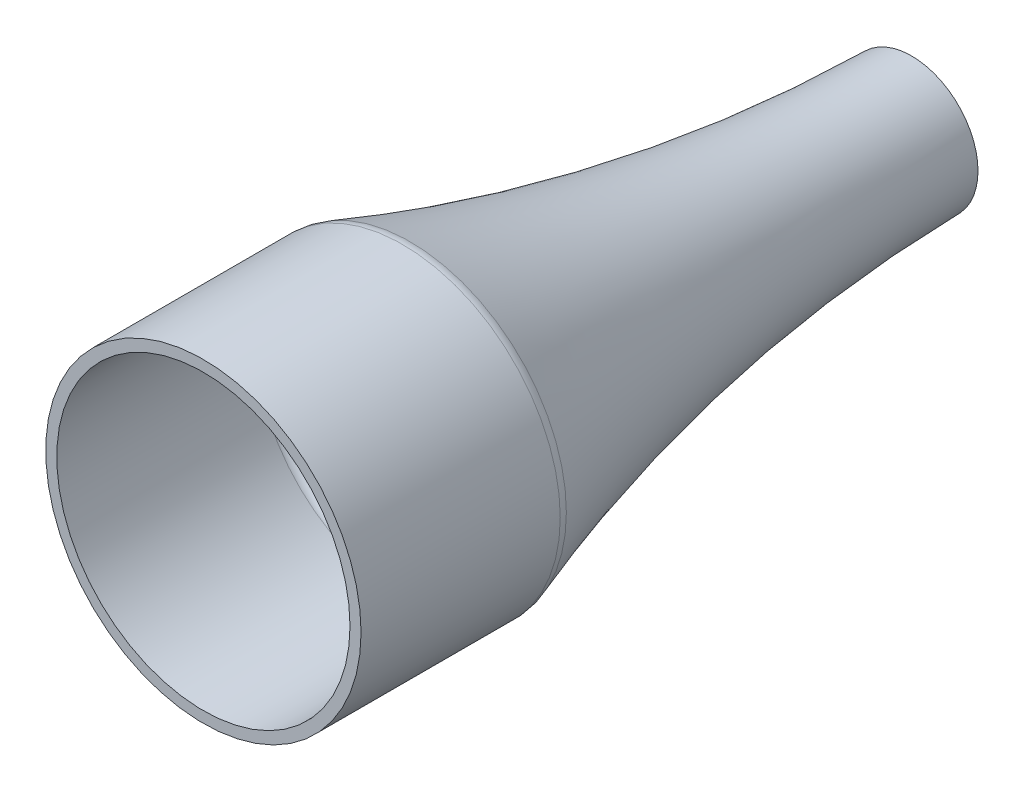
ISO-10303-21;
HEADER;
FILE_DESCRIPTION(('STEP AP214'),'2;1');
FILE_NAME('part.step','',(''),(''),'','','');
FILE_SCHEMA(('AUTOMOTIVE_DESIGN { 1 0 10303 214 1 1 1 1 }'));
ENDSEC;
DATA;
#1=APPLICATION_CONTEXT('core data for automotive mechanical design processes');
#2=APPLICATION_PROTOCOL_DEFINITION('international standard','automotive_design',2000,#1);
#3=PRODUCT_CONTEXT('',#1,'mechanical');
#4=PRODUCT('Part','Part','',(#3));
#5=PRODUCT_RELATED_PRODUCT_CATEGORY('part','',(#4));
#6=PRODUCT_DEFINITION_FORMATION('','',#4);
#7=PRODUCT_DEFINITION_CONTEXT('part definition',#1,'design');
#8=PRODUCT_DEFINITION('design','',#6,#7);
#9=PRODUCT_DEFINITION_SHAPE('','',#8);
#10=(LENGTH_UNIT() NAMED_UNIT(*) SI_UNIT(.MILLI.,.METRE.));
#11=(NAMED_UNIT(*) PLANE_ANGLE_UNIT() SI_UNIT($,.RADIAN.));
#12=(NAMED_UNIT(*) SI_UNIT($,.STERADIAN.) SOLID_ANGLE_UNIT());
#13=UNCERTAINTY_MEASURE_WITH_UNIT(LENGTH_MEASURE(1.E-05),#10,'distance_accuracy_value','');
#14=(GEOMETRIC_REPRESENTATION_CONTEXT(3) GLOBAL_UNCERTAINTY_ASSIGNED_CONTEXT((#13)) GLOBAL_UNIT_ASSIGNED_CONTEXT((#10,
#11,#12)) REPRESENTATION_CONTEXT('',''));
#15=CARTESIAN_POINT('',(0.,0.,0.));
#16=DIRECTION('',(0.,0.,1.));
#17=DIRECTION('',(1.,0.,0.));
#18=AXIS2_PLACEMENT_3D('',#15,#16,#17);
#19=CARTESIAN_POINT('',(0.,0.,0.));
#20=DIRECTION('',(0.,0.,1.));
#21=DIRECTION('',(1.,0.,0.));
#22=AXIS2_PLACEMENT_3D('',#19,#20,#21);
#23=PLANE('',#22);
#24=CARTESIAN_POINT('',(0.,0.,0.));
#25=DIRECTION('',(0.,0.,1.));
#26=DIRECTION('',(1.,0.,0.));
#27=AXIS2_PLACEMENT_3D('',#24,#25,#26);
#28=CIRCLE('',#27,2.5);
#29=CARTESIAN_POINT('',(2.5,0.,0.));
#30=VERTEX_POINT('',#29);
#31=EDGE_CURVE('E65',#30,#30,#28,.T.);
#32=ORIENTED_EDGE('',*,*,#31,.T.);
#33=EDGE_LOOP('',(#32));
#34=FACE_BOUND('',#33,.T.);
#35=CARTESIAN_POINT('',(0.,0.,0.));
#36=DIRECTION('',(0.,0.,1.));
#37=DIRECTION('',(1.,0.,0.));
#38=AXIS2_PLACEMENT_3D('',#35,#36,#37);
#39=CIRCLE('',#38,3.);
#40=CARTESIAN_POINT('',(3.,0.,0.));
#41=VERTEX_POINT('',#40);
#42=EDGE_CURVE('E52',#41,#41,#39,.T.);
#43=ORIENTED_EDGE('',*,*,#42,.F.);
#44=EDGE_LOOP('',(#43));
#45=FACE_BOUND('',#44,.T.);
#46=ADVANCED_FACE('F41',(#34,#45),#23,.F.);
#47=CARTESIAN_POINT('',(0.,0.,22.));
#48=DIRECTION('',(0.,0.,1.));
#49=DIRECTION('',(1.,0.,0.));
#50=AXIS2_PLACEMENT_3D('',#47,#48,#49);
#51=CYLINDRICAL_SURFACE('',#50,7.125);
#52=CARTESIAN_POINT('',(0.,0.,23.));
#53=DIRECTION('',(0.,0.,1.));
#54=DIRECTION('',(1.,0.,0.));
#55=AXIS2_PLACEMENT_3D('',#52,#53,#54);
#56=CIRCLE('',#55,7.125);
#57=CARTESIAN_POINT('',(7.125,0.,23.));
#58=VERTEX_POINT('',#57);
#59=EDGE_CURVE('E48',#58,#58,#56,.T.);
#60=ORIENTED_EDGE('',*,*,#59,.T.);
#61=EDGE_LOOP('',(#60));
#62=FACE_BOUND('',#61,.T.);
#63=CARTESIAN_POINT('',(0.,0.,32.));
#64=DIRECTION('',(0.,0.,1.));
#65=DIRECTION('',(1.,0.,0.));
#66=AXIS2_PLACEMENT_3D('',#63,#64,#65);
#67=CIRCLE('',#66,7.125);
#68=CARTESIAN_POINT('',(7.125,0.,32.));
#69=VERTEX_POINT('',#68);
#70=EDGE_CURVE('E56',#69,#69,#67,.T.);
#71=ORIENTED_EDGE('',*,*,#70,.F.);
#72=EDGE_LOOP('',(#71));
#73=FACE_BOUND('',#72,.T.);
#74=ADVANCED_FACE('F95',(#62,#73),#51,.T.);
#75=CARTESIAN_POINT('',(0.,0.,32.));
#76=DIRECTION('',(0.,0.,1.));
#77=DIRECTION('',(1.,0.,0.));
#78=AXIS2_PLACEMENT_3D('',#75,#76,#77);
#79=PLANE('',#78);
#80=CARTESIAN_POINT('',(0.,0.,32.));
#81=DIRECTION('',(0.,0.,1.));
#82=DIRECTION('',(1.,0.,0.));
#83=AXIS2_PLACEMENT_3D('',#80,#81,#82);
#84=CIRCLE('',#83,6.625);
#85=CARTESIAN_POINT('',(6.625,0.,32.));
#86=VERTEX_POINT('',#85);
#87=EDGE_CURVE('E62',#86,#86,#84,.T.);
#88=ORIENTED_EDGE('',*,*,#87,.F.);
#89=EDGE_LOOP('',(#88));
#90=FACE_BOUND('',#89,.T.);
#91=ORIENTED_EDGE('',*,*,#70,.T.);
#92=EDGE_LOOP('',(#91));
#93=FACE_BOUND('',#92,.T.);
#94=ADVANCED_FACE('F102',(#90,#93),#79,.T.);
#95=CARTESIAN_POINT('',(0.,0.,23.));
#96=DIRECTION('',(0.,0.,1.));
#97=DIRECTION('',(1.,0.,0.));
#98=AXIS2_PLACEMENT_3D('',#95,#96,#97);
#99=TOROIDAL_SURFACE('',#98,6.125,1.);
#100=CARTESIAN_POINT('',(0.,0.,22.6660819521754));
#101=DIRECTION('',(0.,0.,1.));
#102=DIRECTION('',(1.,0.,0.));
#103=AXIS2_PLACEMENT_3D('',#100,#101,#102);
#104=CIRCLE('',#103,7.06760210976688);
#105=CARTESIAN_POINT('',(7.06760210976688,0.,22.6660819521754));
#106=VERTEX_POINT('',#105);
#107=EDGE_CURVE('E10',#106,#106,#104,.T.);
#108=ORIENTED_EDGE('',*,*,#107,.T.);
#109=EDGE_LOOP('',(#108));
#110=FACE_BOUND('',#109,.T.);
#111=ORIENTED_EDGE('',*,*,#59,.F.);
#112=EDGE_LOOP('',(#111));
#113=FACE_BOUND('',#112,.T.);
#114=ADVANCED_FACE('F106',(#110,#113),#99,.T.);
#115=CARTESIAN_POINT('',(0.,0.,32.));
#116=DIRECTION('',(0.,0.,-1.));
#117=DIRECTION('',(-1.,0.,0.));
#118=AXIS2_PLACEMENT_3D('',#115,#116,#117);
#119=CYLINDRICAL_SURFACE('',#118,2.5);
#120=ORIENTED_EDGE('',*,*,#31,.F.);
#121=EDGE_LOOP('',(#120));
#122=FACE_BOUND('',#121,.T.);
#123=CARTESIAN_POINT('',(0.,0.,22.5));
#124=DIRECTION('',(0.,0.,1.));
#125=DIRECTION('',(1.,0.,0.));
#126=AXIS2_PLACEMENT_3D('',#123,#124,#125);
#127=CIRCLE('',#126,2.5);
#128=CARTESIAN_POINT('',(2.5,0.,22.5));
#129=VERTEX_POINT('',#128);
#130=EDGE_CURVE('E68',#129,#129,#127,.T.);
#131=ORIENTED_EDGE('',*,*,#130,.T.);
#132=EDGE_LOOP('',(#131));
#133=FACE_BOUND('',#132,.T.);
#134=ADVANCED_FACE('F77',(#122,#133),#119,.F.);
#135=CARTESIAN_POINT('',(0.,0.,22.));
#136=DIRECTION('',(0.,0.,1.));
#137=DIRECTION('',(1.,0.,0.));
#138=AXIS2_PLACEMENT_3D('',#135,#136,#137);
#139=CYLINDRICAL_SURFACE('',#138,6.625);
#140=CARTESIAN_POINT('',(0.,0.,23.));
#141=DIRECTION('',(0.,0.,1.));
#142=DIRECTION('',(1.,0.,0.));
#143=AXIS2_PLACEMENT_3D('',#140,#141,#142);
#144=CIRCLE('',#143,6.625);
#145=CARTESIAN_POINT('',(6.625,0.,23.));
#146=VERTEX_POINT('',#145);
#147=EDGE_CURVE('E69',#146,#146,#144,.T.);
#148=ORIENTED_EDGE('',*,*,#147,.F.);
#149=EDGE_LOOP('',(#148));
#150=FACE_BOUND('',#149,.T.);
#151=ORIENTED_EDGE('',*,*,#87,.T.);
#152=EDGE_LOOP('',(#151));
#153=FACE_BOUND('',#152,.T.);
#154=ADVANCED_FACE('F82',(#150,#153),#139,.F.);
#155=CARTESIAN_POINT('',(0.,0.,22.5));
#156=DIRECTION('',(0.,0.,1.));
#157=DIRECTION('',(1.,0.,0.));
#158=AXIS2_PLACEMENT_3D('',#155,#156,#157);
#159=PLANE('',#158);
#160=CARTESIAN_POINT('',(0.,0.,22.5));
#161=DIRECTION('',(0.,0.,1.));
#162=DIRECTION('',(1.,0.,0.));
#163=AXIS2_PLACEMENT_3D('',#160,#161,#162);
#164=CIRCLE('',#163,6.125);
#165=CARTESIAN_POINT('',(6.125,0.,22.5));
#166=VERTEX_POINT('',#165);
#167=EDGE_CURVE('E61',#166,#166,#164,.F.);
#168=ORIENTED_EDGE('',*,*,#167,.F.);
#169=EDGE_LOOP('',(#168));
#170=FACE_BOUND('',#169,.T.);
#171=ORIENTED_EDGE('',*,*,#130,.F.);
#172=EDGE_LOOP('',(#171));
#173=FACE_BOUND('',#172,.T.);
#174=ADVANCED_FACE('F79',(#170,#173),#159,.T.);
#175=CARTESIAN_POINT('',(0.,0.,23.));
#176=DIRECTION('',(0.,0.,1.));
#177=DIRECTION('',(1.,0.,0.));
#178=AXIS2_PLACEMENT_3D('',#175,#176,#177);
#179=TOROIDAL_SURFACE('',#178,6.125,0.5);
#180=ORIENTED_EDGE('',*,*,#167,.T.);
#181=EDGE_LOOP('',(#180));
#182=FACE_BOUND('',#181,.T.);
#183=ORIENTED_EDGE('',*,*,#147,.T.);
#184=EDGE_LOOP('',(#183));
#185=FACE_BOUND('',#184,.T.);
#186=ADVANCED_FACE('F81',(#182,#185),#179,.F.);
#187=CARTESIAN_POINT('',(0.,0.,-1.0420994433718));
#188=DIRECTION('',(0.,0.,-1.));
#189=DIRECTION('',(-1.,0.,0.));
#190=AXIS2_PLACEMENT_3D('',#187,#188,#189);
#191=TOROIDAL_SURFACE('',#190,73.9923519032165,71.);
#192=ORIENTED_EDGE('',*,*,#42,.T.);
#193=EDGE_LOOP('',(#192));
#194=FACE_BOUND('',#193,.T.);
#195=ORIENTED_EDGE('',*,*,#107,.F.);
#196=EDGE_LOOP('',(#195));
#197=FACE_BOUND('',#196,.T.);
#198=ADVANCED_FACE('F43',(#194,#197),#191,.F.);
#199=CLOSED_SHELL('',(#46,#74,#94,#114,#134,#154,#174,#186,#198));
#200=MANIFOLD_SOLID_BREP('B2',#199);
#201=ADVANCED_BREP_SHAPE_REPRESENTATION('',(#18,#200),#14);
#202=SHAPE_DEFINITION_REPRESENTATION(#9,#201);
ENDSEC;
END-ISO-10303-21;
